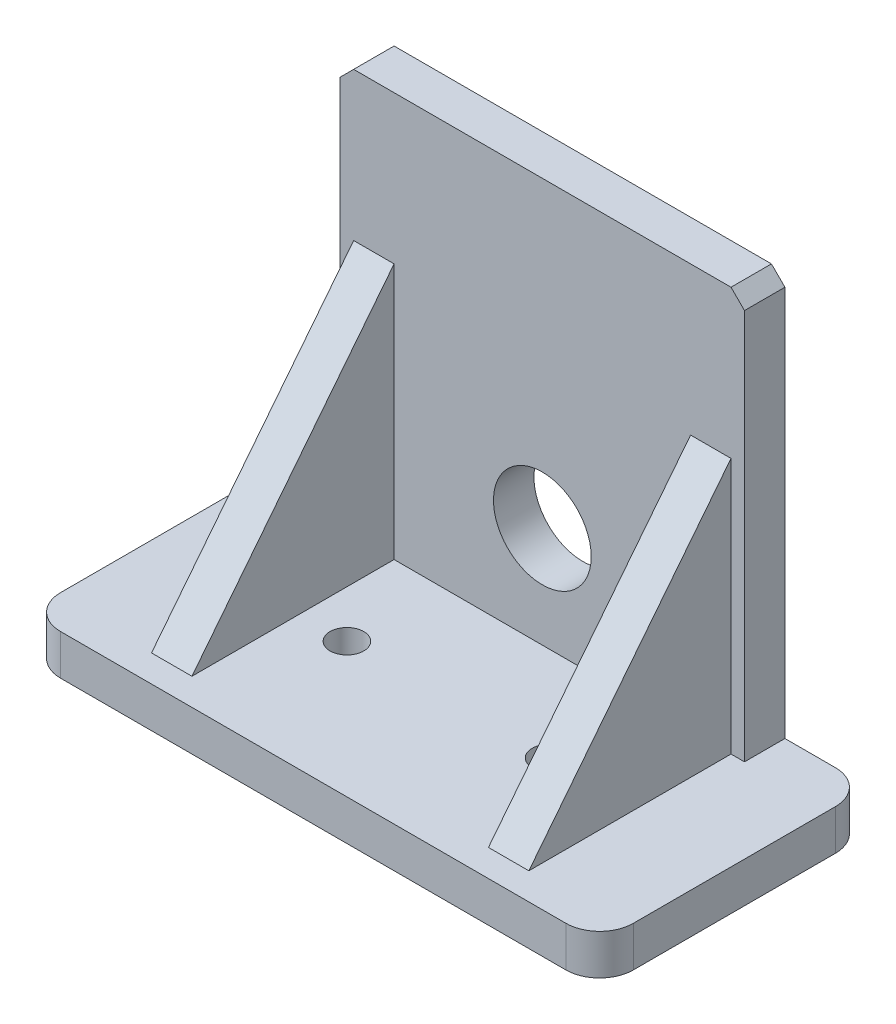
ISO-10303-21;
HEADER;
FILE_DESCRIPTION(('STEP AP214'),'2;1');
FILE_NAME('part.step','',(''),(''),'','','');
FILE_SCHEMA(('AUTOMOTIVE_DESIGN { 1 0 10303 214 1 1 1 1 }'));
ENDSEC;
DATA;
#1=APPLICATION_CONTEXT('core data for automotive mechanical design processes');
#2=APPLICATION_PROTOCOL_DEFINITION('international standard','automotive_design',2000,#1);
#3=PRODUCT_CONTEXT('',#1,'mechanical');
#4=PRODUCT('Part','Part','',(#3));
#5=PRODUCT_RELATED_PRODUCT_CATEGORY('part','',(#4));
#6=PRODUCT_DEFINITION_FORMATION('','',#4);
#7=PRODUCT_DEFINITION_CONTEXT('part definition',#1,'design');
#8=PRODUCT_DEFINITION('design','',#6,#7);
#9=PRODUCT_DEFINITION_SHAPE('','',#8);
#10=(LENGTH_UNIT() NAMED_UNIT(*) SI_UNIT(.MILLI.,.METRE.));
#11=(NAMED_UNIT(*) PLANE_ANGLE_UNIT() SI_UNIT($,.RADIAN.));
#12=(NAMED_UNIT(*) SI_UNIT($,.STERADIAN.) SOLID_ANGLE_UNIT());
#13=UNCERTAINTY_MEASURE_WITH_UNIT(LENGTH_MEASURE(1.E-05),#10,'distance_accuracy_value','');
#14=(GEOMETRIC_REPRESENTATION_CONTEXT(3) GLOBAL_UNCERTAINTY_ASSIGNED_CONTEXT((#13)) GLOBAL_UNIT_ASSIGNED_CONTEXT((#10,
#11,#12)) REPRESENTATION_CONTEXT('',''));
#15=CARTESIAN_POINT('',(0.,0.,0.));
#16=DIRECTION('',(0.,0.,1.));
#17=DIRECTION('',(1.,0.,0.));
#18=AXIS2_PLACEMENT_3D('',#15,#16,#17);
#19=CARTESIAN_POINT('',(-37.5000000000014,6.00000000000078,15.));
#20=DIRECTION('',(0.,-1.,0.));
#21=DIRECTION('',(0.,0.,-0.999999999999958));
#22=AXIS2_PLACEMENT_3D('',#19,#20,#21);
#23=PLANE('',#22);
#24=CARTESIAN_POINT('',(-15.0000000000005,6.00000000000001,0.));
#25=DIRECTION('',(0.,1.,0.));
#26=DIRECTION('',(0.,0.,0.999999999999958));
#27=AXIS2_PLACEMENT_3D('',#24,#25,#26);
#28=CIRCLE('',#27,2.5);
#29=CARTESIAN_POINT('',(-15.0000000000005,6.00000000000001,2.4999999999999));
#30=VERTEX_POINT('',#29);
#31=EDGE_CURVE('E290',#30,#30,#28,.T.);
#32=ORIENTED_EDGE('',*,*,#31,.F.);
#33=EDGE_LOOP('',(#32));
#34=FACE_BOUND('',#33,.T.);
#35=CARTESIAN_POINT('',(15.000000000001,6.00000000000001,0.));
#36=DIRECTION('',(0.,1.,0.));
#37=DIRECTION('',(0.,0.,0.999999999999958));
#38=AXIS2_PLACEMENT_3D('',#35,#36,#37);
#39=CIRCLE('',#38,2.5);
#40=CARTESIAN_POINT('',(15.000000000001,6.00000000000001,2.49999999999989));
#41=VERTEX_POINT('',#40);
#42=EDGE_CURVE('E282',#41,#41,#39,.T.);
#43=ORIENTED_EDGE('',*,*,#42,.F.);
#44=EDGE_LOOP('',(#43));
#45=FACE_BOUND('',#44,.T.);
#46=DIRECTION('',(0.,0.,-0.999999999999958));
#47=VECTOR('',#46,1.);
#48=CARTESIAN_POINT('',(22.0000000000004,5.99999999999923,-14.));
#49=LINE('',#48,#47);
#50=CARTESIAN_POINT('',(22.0000000000006,6.00000000000001,16.));
#51=VERTEX_POINT('',#50);
#52=CARTESIAN_POINT('',(22.0000000000004,5.99999999999923,-14.));
#53=VERTEX_POINT('',#52);
#54=EDGE_CURVE('E193',#51,#53,#49,.T.);
#55=ORIENTED_EDGE('',*,*,#54,.T.);
#56=DIRECTION('',(-1.00000000000004,0.,0.));
#57=VECTOR('',#56,1.);
#58=CARTESIAN_POINT('',(30.0000000000011,5.99999999999923,-14.));
#59=LINE('',#58,#57);
#60=CARTESIAN_POINT('',(-22.000000000001,6.00000000000001,-14.));
#61=VERTEX_POINT('',#60);
#62=EDGE_CURVE('E281',#53,#61,#59,.T.);
#63=ORIENTED_EDGE('',*,*,#62,.T.);
#64=DIRECTION('',(0.,0.,0.999999999999958));
#65=VECTOR('',#64,1.);
#66=CARTESIAN_POINT('',(-22.000000000001,6.00000000000001,-14.));
#67=LINE('',#66,#65);
#68=CARTESIAN_POINT('',(-22.0000000000008,6.00000000000078,16.));
#69=VERTEX_POINT('',#68);
#70=EDGE_CURVE('E225',#61,#69,#67,.T.);
#71=ORIENTED_EDGE('',*,*,#70,.T.);
#72=DIRECTION('',(-1.00000000000004,0.,0.));
#73=VECTOR('',#72,1.);
#74=CARTESIAN_POINT('',(-22.0000000000008,6.00000000000078,16.));
#75=LINE('',#74,#73);
#76=CARTESIAN_POINT('',(-28.0000000000011,6.00000000000078,16.));
#77=VERTEX_POINT('',#76);
#78=EDGE_CURVE('E234',#69,#77,#75,.T.);
#79=ORIENTED_EDGE('',*,*,#78,.T.);
#80=DIRECTION('',(0.,0.,0.999999999999958));
#81=VECTOR('',#80,1.);
#82=CARTESIAN_POINT('',(-28.0000000000013,6.00000000000001,-14.));
#83=LINE('',#82,#81);
#84=CARTESIAN_POINT('',(-28.0000000000013,6.00000000000001,-14.));
#85=VERTEX_POINT('',#84);
#86=EDGE_CURVE('E237',#85,#77,#83,.T.);
#87=ORIENTED_EDGE('',*,*,#86,.F.);
#88=CARTESIAN_POINT('',(-30.0000000000011,6.00000000000001,-14.));
#89=VERTEX_POINT('',#88);
#90=EDGE_CURVE('E261',#85,#89,#59,.T.);
#91=ORIENTED_EDGE('',*,*,#90,.T.);
#92=DIRECTION('',(0.,0.,0.999999999999958));
#93=VECTOR('',#92,1.);
#94=CARTESIAN_POINT('',(-30.0000000000011,6.00000000000078,-19.9999999999992));
#95=LINE('',#94,#93);
#96=CARTESIAN_POINT('',(-30.0000000000011,6.00000000000078,-19.9999999999992));
#97=VERTEX_POINT('',#96);
#98=EDGE_CURVE('E264',#97,#89,#95,.T.);
#99=ORIENTED_EDGE('',*,*,#98,.F.);
#100=DIRECTION('',(-1.00000000000004,0.,0.));
#101=VECTOR('',#100,1.);
#102=CARTESIAN_POINT('',(-37.5000000000014,6.00000000000078,-19.9999999999992));
#103=LINE('',#102,#101);
#104=CARTESIAN_POINT('',(-37.5000000000014,6.00000000000078,-19.9999999999992));
#105=VERTEX_POINT('',#104);
#106=EDGE_CURVE('E315',#97,#105,#103,.T.);
#107=ORIENTED_EDGE('',*,*,#106,.T.);
#108=CARTESIAN_POINT('',(-37.5000000000014,6.00000000000078,-15.));
#109=DIRECTION('',(0.,1.,0.));
#110=DIRECTION('',(0.,0.,-0.999999999999958));
#111=AXIS2_PLACEMENT_3D('',#108,#109,#110);
#112=CIRCLE('',#111,5.);
#113=CARTESIAN_POINT('',(-42.5000000000014,6.00000000000001,-15.));
#114=VERTEX_POINT('',#113);
#115=EDGE_CURVE('E320',#105,#114,#112,.T.);
#116=ORIENTED_EDGE('',*,*,#115,.T.);
#117=DIRECTION('',(0.,0.,0.999999999999958));
#118=VECTOR('',#117,1.);
#119=CARTESIAN_POINT('',(-42.5000000000014,6.00000000000001,15.));
#120=LINE('',#119,#118);
#121=CARTESIAN_POINT('',(-42.5000000000014,6.00000000000001,15.));
#122=VERTEX_POINT('',#121);
#123=EDGE_CURVE('E323',#114,#122,#120,.T.);
#124=ORIENTED_EDGE('',*,*,#123,.T.);
#125=CARTESIAN_POINT('',(-37.5000000000014,6.00000000000078,15.));
#126=DIRECTION('',(0.,1.,0.));
#127=DIRECTION('',(0.,0.,-0.999999999999958));
#128=AXIS2_PLACEMENT_3D('',#125,#126,#127);
#129=CIRCLE('',#128,5.);
#130=CARTESIAN_POINT('',(-37.5000000000014,6.00000000000078,19.9999999999992));
#131=VERTEX_POINT('',#130);
#132=EDGE_CURVE('E298',#122,#131,#129,.T.);
#133=ORIENTED_EDGE('',*,*,#132,.T.);
#134=DIRECTION('',(1.00000000000004,0.,0.));
#135=VECTOR('',#134,1.);
#136=CARTESIAN_POINT('',(-37.5000000000014,6.00000000000078,19.9999999999992));
#137=LINE('',#136,#135);
#138=CARTESIAN_POINT('',(37.5000000000009,6.00000000000001,19.9999999999992));
#139=VERTEX_POINT('',#138);
#140=EDGE_CURVE('E302',#131,#139,#137,.T.);
#141=ORIENTED_EDGE('',*,*,#140,.T.);
#142=CARTESIAN_POINT('',(37.5000000000009,6.00000000000001,15.));
#143=DIRECTION('',(0.,1.,0.));
#144=DIRECTION('',(0.,0.,0.999999999999958));
#145=AXIS2_PLACEMENT_3D('',#142,#143,#144);
#146=CIRCLE('',#145,5.);
#147=CARTESIAN_POINT('',(42.5000000000009,6.00000000000001,15.));
#148=VERTEX_POINT('',#147);
#149=EDGE_CURVE('E306',#139,#148,#146,.T.);
#150=ORIENTED_EDGE('',*,*,#149,.T.);
#151=DIRECTION('',(0.,0.,-0.999999999999958));
#152=VECTOR('',#151,1.);
#153=CARTESIAN_POINT('',(42.5000000000009,6.00000000000001,15.));
#154=LINE('',#153,#152);
#155=CARTESIAN_POINT('',(42.5000000000009,6.00000000000001,-15.));
#156=VERTEX_POINT('',#155);
#157=EDGE_CURVE('E309',#148,#156,#154,.T.);
#158=ORIENTED_EDGE('',*,*,#157,.T.);
#159=CARTESIAN_POINT('',(37.5000000000009,6.00000000000001,-15.));
#160=DIRECTION('',(0.,1.,0.));
#161=DIRECTION('',(0.,0.,-0.999999999999958));
#162=AXIS2_PLACEMENT_3D('',#159,#160,#161);
#163=CIRCLE('',#162,5.);
#164=CARTESIAN_POINT('',(37.5000000000009,6.00000000000078,-19.9999999999992));
#165=VERTEX_POINT('',#164);
#166=EDGE_CURVE('E312',#156,#165,#163,.T.);
#167=ORIENTED_EDGE('',*,*,#166,.T.);
#168=CARTESIAN_POINT('',(30.0000000000011,6.00000000000001,-19.9999999999992));
#169=VERTEX_POINT('',#168);
#170=EDGE_CURVE('E316',#165,#169,#103,.T.);
#171=ORIENTED_EDGE('',*,*,#170,.T.);
#172=DIRECTION('',(0.,0.,0.999999999999958));
#173=VECTOR('',#172,1.);
#174=CARTESIAN_POINT('',(30.0000000000011,6.00000000000001,-19.9999999999992));
#175=LINE('',#174,#173);
#176=CARTESIAN_POINT('',(30.0000000000011,5.99999999999923,-14.));
#177=VERTEX_POINT('',#176);
#178=EDGE_CURVE('E253',#169,#177,#175,.T.);
#179=ORIENTED_EDGE('',*,*,#178,.T.);
#180=CARTESIAN_POINT('',(28.000000000001,5.99999999999923,-14.));
#181=VERTEX_POINT('',#180);
#182=EDGE_CURVE('E278',#177,#181,#59,.T.);
#183=ORIENTED_EDGE('',*,*,#182,.T.);
#184=DIRECTION('',(0.,0.,-0.999999999999958));
#185=VECTOR('',#184,1.);
#186=CARTESIAN_POINT('',(28.000000000001,5.99999999999923,-14.));
#187=LINE('',#186,#185);
#188=CARTESIAN_POINT('',(28.0000000000012,6.00000000000001,16.));
#189=VERTEX_POINT('',#188);
#190=EDGE_CURVE('E202',#189,#181,#187,.T.);
#191=ORIENTED_EDGE('',*,*,#190,.F.);
#192=DIRECTION('',(1.00000000000004,0.,0.));
#193=VECTOR('',#192,1.);
#194=CARTESIAN_POINT('',(22.0000000000006,6.00000000000001,16.));
#195=LINE('',#194,#193);
#196=EDGE_CURVE('E192',#51,#189,#195,.T.);
#197=ORIENTED_EDGE('',*,*,#196,.F.);
#198=EDGE_LOOP('',(#55,#63,#71,#79,#87,#91,#99,#107,#116,#124,#133,#141,#150,#158,#167,#171,
#179,#183,#191,#197));
#199=FACE_BOUND('',#198,.T.);
#200=ADVANCED_FACE('F38',(#34,#45,#199),#23,.F.);
#201=CARTESIAN_POINT('',(30.0000000000011,5.99999999999923,-14.));
#202=DIRECTION('',(0.,0.,0.999999999999958));
#203=DIRECTION('',(1.00000000000004,0.,0.));
#204=AXIS2_PLACEMENT_3D('',#201,#202,#203);
#205=PLANE('',#204);
#206=CARTESIAN_POINT('',(0.,21.,-14.));
#207=DIRECTION('',(0.,0.,0.999999999999958));
#208=DIRECTION('',(1.00000000000004,0.,0.));
#209=AXIS2_PLACEMENT_3D('',#206,#207,#208);
#210=CIRCLE('',#209,7.25);
#211=CARTESIAN_POINT('',(7.25000000000034,21.,-14.));
#212=VERTEX_POINT('',#211);
#213=EDGE_CURVE('E211',#212,#212,#210,.T.);
#214=ORIENTED_EDGE('',*,*,#213,.F.);
#215=EDGE_LOOP('',(#214));
#216=FACE_BOUND('',#215,.T.);
#217=DIRECTION('',(0.,1.,0.));
#218=VECTOR('',#217,1.);
#219=CARTESIAN_POINT('',(30.0000000000011,5.99999999999923,-14.));
#220=LINE('',#219,#218);
#221=CARTESIAN_POINT('',(30.0000000000015,63.9999999999986,-13.9999999999992));
#222=VERTEX_POINT('',#221);
#223=EDGE_CURVE('E258',#177,#222,#220,.T.);
#224=ORIENTED_EDGE('',*,*,#223,.T.);
#225=DIRECTION('',(0.707106781186568,-0.707106781186555,0.));
#226=VECTOR('',#225,1.);
#227=CARTESIAN_POINT('',(59.0000000000028,34.9999999999985,-13.9999999999992));
#228=LINE('',#227,#226);
#229=CARTESIAN_POINT('',(28.0000000000015,66.,-14.));
#230=VERTEX_POINT('',#229);
#231=EDGE_CURVE('E48',#222,#230,#228,.F.);
#232=ORIENTED_EDGE('',*,*,#231,.T.);
#233=DIRECTION('',(-1.00000000000004,0.,0.));
#234=VECTOR('',#233,1.);
#235=CARTESIAN_POINT('',(30.0000000000018,65.9999999999987,-14.));
#236=LINE('',#235,#234);
#237=CARTESIAN_POINT('',(-28.0000000000008,66.,-14.));
#238=VERTEX_POINT('',#237);
#239=EDGE_CURVE('E275',#230,#238,#236,.T.);
#240=ORIENTED_EDGE('',*,*,#239,.T.);
#241=DIRECTION('',(-0.707106781186564,-0.70710678118654,0.));
#242=VECTOR('',#241,1.);
#243=CARTESIAN_POINT('',(-29.0000000000004,65.000000000001,-14.));
#244=LINE('',#243,#242);
#245=CARTESIAN_POINT('',(-30.0000000000006,64.0000000000008,-13.9999999999992));
#246=VERTEX_POINT('',#245);
#247=EDGE_CURVE('E55',#238,#246,#244,.T.);
#248=ORIENTED_EDGE('',*,*,#247,.T.);
#249=DIRECTION('',(0.,1.,0.));
#250=VECTOR('',#249,1.);
#251=CARTESIAN_POINT('',(-30.0000000000011,6.00000000000001,-14.));
#252=LINE('',#251,#250);
#253=EDGE_CURVE('E254',#89,#246,#252,.T.);
#254=ORIENTED_EDGE('',*,*,#253,.F.);
#255=ORIENTED_EDGE('',*,*,#90,.F.);
#256=DIRECTION('',(0.,-1.,0.));
#257=VECTOR('',#256,1.);
#258=CARTESIAN_POINT('',(-28.0000000000013,6.00000000000001,-14.));
#259=LINE('',#258,#257);
#260=CARTESIAN_POINT('',(-28.0000000000012,44.,-14.));
#261=VERTEX_POINT('',#260);
#262=EDGE_CURVE('E219',#261,#85,#259,.T.);
#263=ORIENTED_EDGE('',*,*,#262,.F.);
#264=DIRECTION('',(-1.00000000000004,0.,0.));
#265=VECTOR('',#264,1.);
#266=CARTESIAN_POINT('',(-22.0000000000009,44.,-14.));
#267=LINE('',#266,#265);
#268=CARTESIAN_POINT('',(-22.0000000000009,44.,-14.));
#269=VERTEX_POINT('',#268);
#270=EDGE_CURVE('E242',#269,#261,#267,.T.);
#271=ORIENTED_EDGE('',*,*,#270,.F.);
#272=DIRECTION('',(0.,-1.,0.));
#273=VECTOR('',#272,1.);
#274=CARTESIAN_POINT('',(-22.000000000001,6.00000000000001,-14.));
#275=LINE('',#274,#273);
#276=EDGE_CURVE('E221',#269,#61,#275,.T.);
#277=ORIENTED_EDGE('',*,*,#276,.T.);
#278=ORIENTED_EDGE('',*,*,#62,.F.);
#279=DIRECTION('',(0.,1.,0.));
#280=VECTOR('',#279,1.);
#281=CARTESIAN_POINT('',(22.0000000000004,5.99999999999923,-14.));
#282=LINE('',#281,#280);
#283=CARTESIAN_POINT('',(22.0000000000006,43.9999999999992,-14.));
#284=VERTEX_POINT('',#283);
#285=EDGE_CURVE('E187',#53,#284,#282,.T.);
#286=ORIENTED_EDGE('',*,*,#285,.T.);
#287=DIRECTION('',(1.00000000000004,0.,0.));
#288=VECTOR('',#287,1.);
#289=CARTESIAN_POINT('',(22.0000000000006,43.9999999999992,-14.));
#290=LINE('',#289,#288);
#291=CARTESIAN_POINT('',(28.0000000000011,44.,-14.));
#292=VERTEX_POINT('',#291);
#293=EDGE_CURVE('E179',#284,#292,#290,.T.);
#294=ORIENTED_EDGE('',*,*,#293,.T.);
#295=DIRECTION('',(0.,1.,0.));
#296=VECTOR('',#295,1.);
#297=CARTESIAN_POINT('',(28.000000000001,5.99999999999923,-14.));
#298=LINE('',#297,#296);
#299=EDGE_CURVE('E183',#181,#292,#298,.T.);
#300=ORIENTED_EDGE('',*,*,#299,.F.);
#301=ORIENTED_EDGE('',*,*,#182,.F.);
#302=EDGE_LOOP('',(#224,#232,#240,#248,#254,#255,#263,#271,#277,#278,#286,#294,#300,#301));
#303=FACE_BOUND('',#302,.T.);
#304=ADVANCED_FACE('F181',(#216,#303),#205,.T.);
#305=CARTESIAN_POINT('',(-37.5000000000012,0.,15.));
#306=DIRECTION('',(0.,-1.,0.));
#307=DIRECTION('',(0.,0.,-0.999999999999958));
#308=AXIS2_PLACEMENT_3D('',#305,#306,#307);
#309=PLANE('',#308);
#310=CARTESIAN_POINT('',(-15.0000000000004,0.,0.));
#311=DIRECTION('',(0.,1.,0.));
#312=DIRECTION('',(0.,0.,0.999999999999958));
#313=AXIS2_PLACEMENT_3D('',#310,#311,#312);
#314=CIRCLE('',#313,2.5);
#315=CARTESIAN_POINT('',(-15.0000000000004,0.,2.4999999999999));
#316=VERTEX_POINT('',#315);
#317=EDGE_CURVE('E286',#316,#316,#314,.T.);
#318=ORIENTED_EDGE('',*,*,#317,.T.);
#319=EDGE_LOOP('',(#318));
#320=FACE_BOUND('',#319,.T.);
#321=CARTESIAN_POINT('',(-37.5000000000012,0.,15.));
#322=DIRECTION('',(0.,1.,0.));
#323=DIRECTION('',(0.,0.,-0.999999999999958));
#324=AXIS2_PLACEMENT_3D('',#321,#322,#323);
#325=CIRCLE('',#324,5.);
#326=CARTESIAN_POINT('',(-42.5000000000012,0.,15.));
#327=VERTEX_POINT('',#326);
#328=CARTESIAN_POINT('',(-37.5000000000011,1.55431223447522E-12,19.9999999999992));
#329=VERTEX_POINT('',#328);
#330=EDGE_CURVE('E294',#327,#329,#325,.T.);
#331=ORIENTED_EDGE('',*,*,#330,.F.);
#332=DIRECTION('',(0.,0.,0.999999999999958));
#333=VECTOR('',#332,1.);
#334=CARTESIAN_POINT('',(-42.5000000000012,0.,15.));
#335=LINE('',#334,#333);
#336=CARTESIAN_POINT('',(-42.5000000000012,0.,-15.));
#337=VERTEX_POINT('',#336);
#338=EDGE_CURVE('E303',#337,#327,#335,.T.);
#339=ORIENTED_EDGE('',*,*,#338,.F.);
#340=CARTESIAN_POINT('',(-37.5000000000012,0.,-15.));
#341=DIRECTION('',(0.,1.,0.));
#342=DIRECTION('',(0.,0.,-0.999999999999958));
#343=AXIS2_PLACEMENT_3D('',#340,#341,#342);
#344=CIRCLE('',#343,5.);
#345=CARTESIAN_POINT('',(-37.5000000000011,0.,-20.));
#346=VERTEX_POINT('',#345);
#347=EDGE_CURVE('E345',#346,#337,#344,.T.);
#348=ORIENTED_EDGE('',*,*,#347,.F.);
#349=DIRECTION('',(-1.00000000000004,0.,0.));
#350=VECTOR('',#349,1.);
#351=CARTESIAN_POINT('',(-37.5000000000011,0.,-20.));
#352=LINE('',#351,#350);
#353=CARTESIAN_POINT('',(37.5000000000011,-1.55431223447522E-12,-20.));
#354=VERTEX_POINT('',#353);
#355=EDGE_CURVE('E342',#354,#346,#352,.T.);
#356=ORIENTED_EDGE('',*,*,#355,.F.);
#357=CARTESIAN_POINT('',(37.5000000000012,-2.60902410786912E-12,-15.));
#358=DIRECTION('',(0.,1.,0.));
#359=DIRECTION('',(0.,0.,-0.999999999999958));
#360=AXIS2_PLACEMENT_3D('',#357,#358,#359);
#361=CIRCLE('',#360,5.);
#362=CARTESIAN_POINT('',(42.5000000000012,0.,-15.));
#363=VERTEX_POINT('',#362);
#364=EDGE_CURVE('E339',#363,#354,#361,.T.);
#365=ORIENTED_EDGE('',*,*,#364,.F.);
#366=DIRECTION('',(0.,0.,-0.999999999999958));
#367=VECTOR('',#366,1.);
#368=CARTESIAN_POINT('',(42.5000000000012,-2.60902410786912E-12,15.));
#369=LINE('',#368,#367);
#370=CARTESIAN_POINT('',(42.5000000000012,-2.60902410786912E-12,15.));
#371=VERTEX_POINT('',#370);
#372=EDGE_CURVE('E336',#371,#363,#369,.T.);
#373=ORIENTED_EDGE('',*,*,#372,.F.);
#374=CARTESIAN_POINT('',(37.5000000000012,0.,15.));
#375=DIRECTION('',(0.,1.,0.));
#376=DIRECTION('',(0.,0.,0.999999999999958));
#377=AXIS2_PLACEMENT_3D('',#374,#375,#376);
#378=CIRCLE('',#377,5.);
#379=CARTESIAN_POINT('',(37.5000000000011,-2.60902410786912E-12,19.9999999999992));
#380=VERTEX_POINT('',#379);
#381=EDGE_CURVE('E333',#380,#371,#378,.T.);
#382=ORIENTED_EDGE('',*,*,#381,.F.);
#383=DIRECTION('',(1.00000000000004,0.,0.));
#384=VECTOR('',#383,1.);
#385=CARTESIAN_POINT('',(-37.5000000000011,1.55431223447522E-12,19.9999999999992));
#386=LINE('',#385,#384);
#387=EDGE_CURVE('E330',#329,#380,#386,.T.);
#388=ORIENTED_EDGE('',*,*,#387,.F.);
#389=EDGE_LOOP('',(#331,#339,#348,#356,#365,#373,#382,#388));
#390=FACE_BOUND('',#389,.T.);
#391=CARTESIAN_POINT('',(15.0000000000008,0.,0.));
#392=DIRECTION('',(0.,1.,0.));
#393=DIRECTION('',(0.,0.,0.999999999999958));
#394=AXIS2_PLACEMENT_3D('',#391,#392,#393);
#395=CIRCLE('',#394,2.5);
#396=CARTESIAN_POINT('',(15.0000000000007,0.,2.49999999999989));
#397=VERTEX_POINT('',#396);
#398=EDGE_CURVE('E274',#397,#397,#395,.T.);
#399=ORIENTED_EDGE('',*,*,#398,.T.);
#400=EDGE_LOOP('',(#399));
#401=FACE_BOUND('',#400,.T.);
#402=ADVANCED_FACE('F423',(#320,#390,#401),#309,.T.);
#403=CARTESIAN_POINT('',(-37.5000000000014,6.00000000000078,15.));
#404=DIRECTION('',(0.,-1.,0.));
#405=DIRECTION('',(0.,0.,-0.999999999999958));
#406=AXIS2_PLACEMENT_3D('',#403,#404,#405);
#407=CYLINDRICAL_SURFACE('',#406,5.);
#408=ORIENTED_EDGE('',*,*,#330,.T.);
#409=DIRECTION('',(0.,-1.,0.));
#410=VECTOR('',#409,1.);
#411=CARTESIAN_POINT('',(-37.5000000000014,6.00000000000078,19.9999999999992));
#412=LINE('',#411,#410);
#413=EDGE_CURVE('E377',#131,#329,#412,.T.);
#414=ORIENTED_EDGE('',*,*,#413,.F.);
#415=ORIENTED_EDGE('',*,*,#132,.F.);
#416=DIRECTION('',(0.,-1.,0.));
#417=VECTOR('',#416,1.);
#418=CARTESIAN_POINT('',(-42.5000000000014,6.00000000000001,15.));
#419=LINE('',#418,#417);
#420=EDGE_CURVE('E326',#122,#327,#419,.T.);
#421=ORIENTED_EDGE('',*,*,#420,.T.);
#422=EDGE_LOOP('',(#408,#414,#415,#421));
#423=FACE_BOUND('',#422,.T.);
#424=ADVANCED_FACE('F507',(#423),#407,.T.);
#425=CARTESIAN_POINT('',(-37.5000000000014,6.00000000000078,19.9999999999992));
#426=DIRECTION('',(0.,0.,-0.999999999999958));
#427=DIRECTION('',(-1.00000000000004,0.,0.));
#428=AXIS2_PLACEMENT_3D('',#425,#426,#427);
#429=PLANE('',#428);
#430=ORIENTED_EDGE('',*,*,#387,.T.);
#431=DIRECTION('',(0.,-1.,0.));
#432=VECTOR('',#431,1.);
#433=CARTESIAN_POINT('',(37.5000000000009,6.00000000000001,19.9999999999992));
#434=LINE('',#433,#432);
#435=EDGE_CURVE('E373',#139,#380,#434,.T.);
#436=ORIENTED_EDGE('',*,*,#435,.F.);
#437=ORIENTED_EDGE('',*,*,#140,.F.);
#438=ORIENTED_EDGE('',*,*,#413,.T.);
#439=EDGE_LOOP('',(#430,#436,#437,#438));
#440=FACE_BOUND('',#439,.T.);
#441=ADVANCED_FACE('F540',(#440),#429,.F.);
#442=CARTESIAN_POINT('',(37.5000000000009,6.00000000000001,15.));
#443=DIRECTION('',(0.,-1.,0.));
#444=DIRECTION('',(0.,0.,-0.999999999999958));
#445=AXIS2_PLACEMENT_3D('',#442,#443,#444);
#446=CYLINDRICAL_SURFACE('',#445,5.);
#447=ORIENTED_EDGE('',*,*,#381,.T.);
#448=DIRECTION('',(0.,-1.,0.));
#449=VECTOR('',#448,1.);
#450=CARTESIAN_POINT('',(42.5000000000009,6.00000000000001,15.));
#451=LINE('',#450,#449);
#452=EDGE_CURVE('E369',#148,#371,#451,.T.);
#453=ORIENTED_EDGE('',*,*,#452,.F.);
#454=ORIENTED_EDGE('',*,*,#149,.F.);
#455=ORIENTED_EDGE('',*,*,#435,.T.);
#456=EDGE_LOOP('',(#447,#453,#454,#455));
#457=FACE_BOUND('',#456,.T.);
#458=ADVANCED_FACE('F536',(#457),#446,.T.);
#459=CARTESIAN_POINT('',(42.5000000000009,6.00000000000001,15.));
#460=DIRECTION('',(-1.00000000000004,0.,0.));
#461=DIRECTION('',(0.,0.,0.999999999999958));
#462=AXIS2_PLACEMENT_3D('',#459,#460,#461);
#463=PLANE('',#462);
#464=ORIENTED_EDGE('',*,*,#372,.T.);
#465=DIRECTION('',(0.,-1.,0.));
#466=VECTOR('',#465,1.);
#467=CARTESIAN_POINT('',(42.5000000000009,6.00000000000001,-15.));
#468=LINE('',#467,#466);
#469=EDGE_CURVE('E365',#156,#363,#468,.T.);
#470=ORIENTED_EDGE('',*,*,#469,.F.);
#471=ORIENTED_EDGE('',*,*,#157,.F.);
#472=ORIENTED_EDGE('',*,*,#452,.T.);
#473=EDGE_LOOP('',(#464,#470,#471,#472));
#474=FACE_BOUND('',#473,.T.);
#475=ADVANCED_FACE('F533',(#474),#463,.F.);
#476=CARTESIAN_POINT('',(37.5000000000009,6.00000000000001,-15.));
#477=DIRECTION('',(0.,-1.,0.));
#478=DIRECTION('',(0.,0.,-0.999999999999958));
#479=AXIS2_PLACEMENT_3D('',#476,#477,#478);
#480=CYLINDRICAL_SURFACE('',#479,5.);
#481=ORIENTED_EDGE('',*,*,#364,.T.);
#482=DIRECTION('',(0.,-1.,0.));
#483=VECTOR('',#482,1.);
#484=CARTESIAN_POINT('',(37.5000000000009,6.00000000000078,-19.9999999999992));
#485=LINE('',#484,#483);
#486=EDGE_CURVE('E361',#165,#354,#485,.T.);
#487=ORIENTED_EDGE('',*,*,#486,.F.);
#488=ORIENTED_EDGE('',*,*,#166,.F.);
#489=ORIENTED_EDGE('',*,*,#469,.T.);
#490=EDGE_LOOP('',(#481,#487,#488,#489));
#491=FACE_BOUND('',#490,.T.);
#492=ADVANCED_FACE('F529',(#491),#480,.T.);
#493=CARTESIAN_POINT('',(-37.5000000000014,6.00000000000078,-19.9999999999992));
#494=DIRECTION('',(0.,0.,0.999999999999958));
#495=DIRECTION('',(1.00000000000004,0.,0.));
#496=AXIS2_PLACEMENT_3D('',#493,#494,#495);
#497=PLANE('',#496);
#498=CARTESIAN_POINT('',(1.17527515497429E-13,21.,-19.9999999999992));
#499=DIRECTION('',(0.,0.,0.999999999999958));
#500=DIRECTION('',(1.00000000000004,0.,0.));
#501=AXIS2_PLACEMENT_3D('',#498,#499,#500);
#502=CIRCLE('',#501,7.25);
#503=CARTESIAN_POINT('',(7.25000000000038,21.,-19.9999999999992));
#504=VERTEX_POINT('',#503);
#505=EDGE_CURVE('E206',#504,#504,#502,.T.);
#506=ORIENTED_EDGE('',*,*,#505,.T.);
#507=EDGE_LOOP('',(#506));
#508=FACE_BOUND('',#507,.T.);
#509=DIRECTION('',(-1.00000000000004,0.,0.));
#510=VECTOR('',#509,1.);
#511=CARTESIAN_POINT('',(30.0000000000018,65.9999999999992,-19.9999999999992));
#512=LINE('',#511,#510);
#513=CARTESIAN_POINT('',(28.0000000000015,65.9999999999999,-19.9999999999992));
#514=VERTEX_POINT('',#513);
#515=CARTESIAN_POINT('',(-28.0000000000008,66.,-19.9999999999992));
#516=VERTEX_POINT('',#515);
#517=EDGE_CURVE('E270',#514,#516,#512,.T.);
#518=ORIENTED_EDGE('',*,*,#517,.F.);
#519=DIRECTION('',(-0.707106781186568,0.707106781186555,0.));
#520=VECTOR('',#519,1.);
#521=CARTESIAN_POINT('',(28.0000000000015,65.9999999999999,-19.9999999999992));
#522=LINE('',#521,#520);
#523=CARTESIAN_POINT('',(30.0000000000015,63.9999999999992,-19.9999999999992));
#524=VERTEX_POINT('',#523);
#525=EDGE_CURVE('E391',#514,#524,#522,.F.);
#526=ORIENTED_EDGE('',*,*,#525,.T.);
#527=DIRECTION('',(0.,-1.,0.));
#528=VECTOR('',#527,1.);
#529=CARTESIAN_POINT('',(30.0000000000011,6.00000000000001,-19.9999999999992));
#530=LINE('',#529,#528);
#531=EDGE_CURVE('E250',#524,#169,#530,.T.);
#532=ORIENTED_EDGE('',*,*,#531,.T.);
#533=ORIENTED_EDGE('',*,*,#170,.F.);
#534=ORIENTED_EDGE('',*,*,#486,.T.);
#535=ORIENTED_EDGE('',*,*,#355,.T.);
#536=DIRECTION('',(0.,-1.,0.));
#537=VECTOR('',#536,1.);
#538=CARTESIAN_POINT('',(-37.5000000000014,6.00000000000078,-19.9999999999992));
#539=LINE('',#538,#537);
#540=EDGE_CURVE('E357',#105,#346,#539,.T.);
#541=ORIENTED_EDGE('',*,*,#540,.F.);
#542=ORIENTED_EDGE('',*,*,#106,.F.);
#543=DIRECTION('',(0.,-1.,0.));
#544=VECTOR('',#543,1.);
#545=CARTESIAN_POINT('',(-30.0000000000011,6.00000000000078,-19.9999999999992));
#546=LINE('',#545,#544);
#547=CARTESIAN_POINT('',(-30.0000000000006,64.0000000000008,-19.9999999999992));
#548=VERTEX_POINT('',#547);
#549=EDGE_CURVE('E246',#548,#97,#546,.T.);
#550=ORIENTED_EDGE('',*,*,#549,.F.);
#551=DIRECTION('',(0.707106781186564,0.70710678118654,0.));
#552=VECTOR('',#551,1.);
#553=CARTESIAN_POINT('',(-30.0000000000006,64.0000000000008,-19.9999999999992));
#554=LINE('',#553,#552);
#555=EDGE_CURVE('E388',#548,#516,#554,.T.);
#556=ORIENTED_EDGE('',*,*,#555,.T.);
#557=EDGE_LOOP('',(#518,#526,#532,#533,#534,#535,#541,#542,#550,#556));
#558=FACE_BOUND('',#557,.T.);
#559=ADVANCED_FACE('F409',(#508,#558),#497,.F.);
#560=CARTESIAN_POINT('',(-37.5000000000014,6.00000000000078,-15.));
#561=DIRECTION('',(0.,-1.,0.));
#562=DIRECTION('',(0.,0.,-0.999999999999958));
#563=AXIS2_PLACEMENT_3D('',#560,#561,#562);
#564=CYLINDRICAL_SURFACE('',#563,5.);
#565=ORIENTED_EDGE('',*,*,#347,.T.);
#566=DIRECTION('',(0.,-1.,0.));
#567=VECTOR('',#566,1.);
#568=CARTESIAN_POINT('',(-42.5000000000014,6.00000000000001,-15.));
#569=LINE('',#568,#567);
#570=EDGE_CURVE('E353',#114,#337,#569,.T.);
#571=ORIENTED_EDGE('',*,*,#570,.F.);
#572=ORIENTED_EDGE('',*,*,#115,.F.);
#573=ORIENTED_EDGE('',*,*,#540,.T.);
#574=EDGE_LOOP('',(#565,#571,#572,#573));
#575=FACE_BOUND('',#574,.T.);
#576=ADVANCED_FACE('F429',(#575),#564,.T.);
#577=CARTESIAN_POINT('',(-42.5000000000014,6.00000000000001,15.));
#578=DIRECTION('',(1.00000000000004,0.,0.));
#579=DIRECTION('',(0.,0.,-0.999999999999958));
#580=AXIS2_PLACEMENT_3D('',#577,#578,#579);
#581=PLANE('',#580);
#582=ORIENTED_EDGE('',*,*,#338,.T.);
#583=ORIENTED_EDGE('',*,*,#420,.F.);
#584=ORIENTED_EDGE('',*,*,#123,.F.);
#585=ORIENTED_EDGE('',*,*,#570,.T.);
#586=EDGE_LOOP('',(#582,#583,#584,#585));
#587=FACE_BOUND('',#586,.T.);
#588=ADVANCED_FACE('F433',(#587),#581,.F.);
#589=CARTESIAN_POINT('',(-15.0000000000005,6.00000000000001,0.));
#590=DIRECTION('',(0.,-1.,0.));
#591=DIRECTION('',(0.,0.,-0.999999999999958));
#592=AXIS2_PLACEMENT_3D('',#589,#590,#591);
#593=CYLINDRICAL_SURFACE('',#592,2.5);
#594=ORIENTED_EDGE('',*,*,#31,.T.);
#595=EDGE_LOOP('',(#594));
#596=FACE_BOUND('',#595,.T.);
#597=ORIENTED_EDGE('',*,*,#317,.F.);
#598=EDGE_LOOP('',(#597));
#599=FACE_BOUND('',#598,.T.);
#600=ADVANCED_FACE('F518',(#596,#599),#593,.F.);
#601=CARTESIAN_POINT('',(15.000000000001,6.00000000000001,0.));
#602=DIRECTION('',(0.,-1.,0.));
#603=DIRECTION('',(0.,0.,-0.999999999999958));
#604=AXIS2_PLACEMENT_3D('',#601,#602,#603);
#605=CYLINDRICAL_SURFACE('',#604,2.5);
#606=ORIENTED_EDGE('',*,*,#42,.T.);
#607=EDGE_LOOP('',(#606));
#608=FACE_BOUND('',#607,.T.);
#609=ORIENTED_EDGE('',*,*,#398,.F.);
#610=EDGE_LOOP('',(#609));
#611=FACE_BOUND('',#610,.T.);
#612=ADVANCED_FACE('F515',(#608,#611),#605,.F.);
#613=CARTESIAN_POINT('',(30.0000000000018,65.9999999999992,-19.9999999999992));
#614=DIRECTION('',(0.,1.,0.));
#615=DIRECTION('',(0.,0.,0.999999999999958));
#616=AXIS2_PLACEMENT_3D('',#613,#614,#615);
#617=PLANE('',#616);
#618=ORIENTED_EDGE('',*,*,#239,.F.);
#619=DIRECTION('',(0.,0.,-0.999999999999958));
#620=VECTOR('',#619,1.);
#621=CARTESIAN_POINT('',(28.0000000000015,65.9999999999999,-19.9999999999992));
#622=LINE('',#621,#620);
#623=EDGE_CURVE('E384',#230,#514,#622,.T.);
#624=ORIENTED_EDGE('',*,*,#623,.T.);
#625=ORIENTED_EDGE('',*,*,#517,.T.);
#626=DIRECTION('',(0.,0.,0.999999999999958));
#627=VECTOR('',#626,1.);
#628=CARTESIAN_POINT('',(-28.0000000000008,66.,-14.));
#629=LINE('',#628,#627);
#630=EDGE_CURVE('E381',#516,#238,#629,.T.);
#631=ORIENTED_EDGE('',*,*,#630,.T.);
#632=EDGE_LOOP('',(#618,#624,#625,#631));
#633=FACE_BOUND('',#632,.T.);
#634=ADVANCED_FACE('F404',(#633),#617,.T.);
#635=CARTESIAN_POINT('',(30.0000000000017,-2.60902410786912E-12,0.));
#636=DIRECTION('',(1.00000000000004,0.,0.));
#637=DIRECTION('',(0.,0.,-0.999999999999958));
#638=AXIS2_PLACEMENT_3D('',#635,#636,#637);
#639=PLANE('',#638);
#640=ORIENTED_EDGE('',*,*,#531,.F.);
#641=DIRECTION('',(0.,0.,0.999999999999958));
#642=VECTOR('',#641,1.);
#643=CARTESIAN_POINT('',(30.0000000000015,63.9999999999987,0.));
#644=LINE('',#643,#642);
#645=EDGE_CURVE('E63',#524,#222,#644,.T.);
#646=ORIENTED_EDGE('',*,*,#645,.T.);
#647=ORIENTED_EDGE('',*,*,#223,.F.);
#648=ORIENTED_EDGE('',*,*,#178,.F.);
#649=EDGE_LOOP('',(#640,#646,#647,#648));
#650=FACE_BOUND('',#649,.T.);
#651=ADVANCED_FACE('F412',(#650),#639,.T.);
#652=CARTESIAN_POINT('',(-30.0000000000012,0.,0.));
#653=DIRECTION('',(1.00000000000004,0.,0.));
#654=DIRECTION('',(0.,0.,-0.999999999999958));
#655=AXIS2_PLACEMENT_3D('',#652,#653,#654);
#656=PLANE('',#655);
#657=ORIENTED_EDGE('',*,*,#253,.T.);
#658=DIRECTION('',(0.,0.,-0.999999999999958));
#659=VECTOR('',#658,1.);
#660=CARTESIAN_POINT('',(-30.0000000000006,64.0000000000008,-19.9999999999992));
#661=LINE('',#660,#659);
#662=EDGE_CURVE('E11',#246,#548,#661,.T.);
#663=ORIENTED_EDGE('',*,*,#662,.T.);
#664=ORIENTED_EDGE('',*,*,#549,.T.);
#665=ORIENTED_EDGE('',*,*,#98,.T.);
#666=EDGE_LOOP('',(#657,#663,#664,#665));
#667=FACE_BOUND('',#666,.T.);
#668=ADVANCED_FACE('F581',(#667),#656,.F.);
#669=CARTESIAN_POINT('',(-22.0000000000008,6.00000000000078,16.));
#670=DIRECTION('',(0.,0.619644288579021,0.784882765533384));
#671=DIRECTION('',(0.,-0.784882765533426,0.619644288578979));
#672=AXIS2_PLACEMENT_3D('',#669,#670,#671);
#673=PLANE('',#672);
#674=DIRECTION('',(0.,0.784882765533426,-0.619644288578979));
#675=VECTOR('',#674,1.);
#676=CARTESIAN_POINT('',(-28.0000000000011,6.00000000000078,16.));
#677=LINE('',#676,#675);
#678=EDGE_CURVE('E226',#77,#261,#677,.T.);
#679=ORIENTED_EDGE('',*,*,#678,.F.);
#680=ORIENTED_EDGE('',*,*,#78,.F.);
#681=DIRECTION('',(0.,0.784882765533426,-0.619644288578979));
#682=VECTOR('',#681,1.);
#683=CARTESIAN_POINT('',(-22.0000000000008,6.00000000000078,16.));
#684=LINE('',#683,#682);
#685=EDGE_CURVE('E230',#69,#269,#684,.T.);
#686=ORIENTED_EDGE('',*,*,#685,.T.);
#687=ORIENTED_EDGE('',*,*,#270,.T.);
#688=EDGE_LOOP('',(#679,#680,#686,#687));
#689=FACE_BOUND('',#688,.T.);
#690=ADVANCED_FACE('F574',(#689),#673,.T.);
#691=CARTESIAN_POINT('',(-22.0000000000007,0.,0.));
#692=DIRECTION('',(1.00000000000004,0.,0.));
#693=DIRECTION('',(0.,0.,-0.999999999999958));
#694=AXIS2_PLACEMENT_3D('',#691,#692,#693);
#695=PLANE('',#694);
#696=ORIENTED_EDGE('',*,*,#276,.F.);
#697=ORIENTED_EDGE('',*,*,#685,.F.);
#698=ORIENTED_EDGE('',*,*,#70,.F.);
#699=EDGE_LOOP('',(#696,#697,#698));
#700=FACE_BOUND('',#699,.T.);
#701=ADVANCED_FACE('F571',(#700),#695,.T.);
#702=CARTESIAN_POINT('',(-28.000000000001,0.,0.));
#703=DIRECTION('',(1.00000000000004,0.,0.));
#704=DIRECTION('',(0.,0.,-0.999999999999958));
#705=AXIS2_PLACEMENT_3D('',#702,#703,#704);
#706=PLANE('',#705);
#707=ORIENTED_EDGE('',*,*,#262,.T.);
#708=ORIENTED_EDGE('',*,*,#86,.T.);
#709=ORIENTED_EDGE('',*,*,#678,.T.);
#710=EDGE_LOOP('',(#707,#708,#709));
#711=FACE_BOUND('',#710,.T.);
#712=ADVANCED_FACE('F570',(#711),#706,.F.);
#713=CARTESIAN_POINT('',(22.0000000000006,6.00000000000001,16.));
#714=DIRECTION('',(0.,0.619644288579021,0.784882765533384));
#715=DIRECTION('',(0.,-0.784882765533426,0.619644288578979));
#716=AXIS2_PLACEMENT_3D('',#713,#714,#715);
#717=PLANE('',#716);
#718=DIRECTION('',(0.,-0.784882765533426,0.619644288578979));
#719=VECTOR('',#718,1.);
#720=CARTESIAN_POINT('',(28.0000000000012,6.00000000000001,16.));
#721=LINE('',#720,#719);
#722=EDGE_CURVE('E197',#292,#189,#721,.T.);
#723=ORIENTED_EDGE('',*,*,#722,.F.);
#724=ORIENTED_EDGE('',*,*,#293,.F.);
#725=DIRECTION('',(0.,-0.784882765533426,0.619644288578979));
#726=VECTOR('',#725,1.);
#727=CARTESIAN_POINT('',(22.0000000000006,6.00000000000001,16.));
#728=LINE('',#727,#726);
#729=EDGE_CURVE('E486',#284,#51,#728,.T.);
#730=ORIENTED_EDGE('',*,*,#729,.T.);
#731=ORIENTED_EDGE('',*,*,#196,.T.);
#732=EDGE_LOOP('',(#723,#724,#730,#731));
#733=FACE_BOUND('',#732,.T.);
#734=ADVANCED_FACE('F198',(#733),#717,.T.);
#735=CARTESIAN_POINT('',(22.0000000000007,-2.60902410786912E-12,0.));
#736=DIRECTION('',(1.00000000000004,0.,0.));
#737=DIRECTION('',(0.,0.,-0.999999999999958));
#738=AXIS2_PLACEMENT_3D('',#735,#736,#737);
#739=PLANE('',#738);
#740=ORIENTED_EDGE('',*,*,#285,.F.);
#741=ORIENTED_EDGE('',*,*,#54,.F.);
#742=ORIENTED_EDGE('',*,*,#729,.F.);
#743=EDGE_LOOP('',(#740,#741,#742));
#744=FACE_BOUND('',#743,.T.);
#745=ADVANCED_FACE('F561',(#744),#739,.F.);
#746=CARTESIAN_POINT('',(28.0000000000013,-2.60902410786912E-12,0.));
#747=DIRECTION('',(1.00000000000004,0.,0.));
#748=DIRECTION('',(0.,0.,-0.999999999999958));
#749=AXIS2_PLACEMENT_3D('',#746,#747,#748);
#750=PLANE('',#749);
#751=ORIENTED_EDGE('',*,*,#299,.T.);
#752=ORIENTED_EDGE('',*,*,#722,.T.);
#753=ORIENTED_EDGE('',*,*,#190,.T.);
#754=EDGE_LOOP('',(#751,#752,#753));
#755=FACE_BOUND('',#754,.T.);
#756=ADVANCED_FACE('F204',(#755),#750,.T.);
#757=CARTESIAN_POINT('',(1.17527515497429E-13,21.,-19.9999999999992));
#758=DIRECTION('',(0.,0.,0.999999999999958));
#759=DIRECTION('',(1.00000000000004,0.,0.));
#760=AXIS2_PLACEMENT_3D('',#757,#758,#759);
#761=CYLINDRICAL_SURFACE('',#760,7.25);
#762=CARTESIAN_POINT('',(7.25000000000038,21.,-19.9999999999992));
#763=CARTESIAN_POINT('',(7.25000000000038,21.,-19.9374999999992));
#764=CARTESIAN_POINT('',(7.25000000000038,21.,-19.8749999999992));
#765=CARTESIAN_POINT('',(7.25000000000038,21.,-19.7499999999992));
#766=CARTESIAN_POINT('',(7.25000000000038,21.,-19.6874999999992));
#767=CARTESIAN_POINT('',(7.25000000000038,21.,-19.5624999999992));
#768=CARTESIAN_POINT('',(7.25000000000038,21.,-19.4999999999992));
#769=CARTESIAN_POINT('',(7.25000000000038,21.,-19.3749999999993));
#770=CARTESIAN_POINT('',(7.25000000000038,21.,-19.3124999999993));
#771=CARTESIAN_POINT('',(7.25000000000038,21.,-19.1874999999993));
#772=CARTESIAN_POINT('',(7.25000000000038,21.,-19.1249999999993));
#773=CARTESIAN_POINT('',(7.25000000000038,21.,-18.9999999999993));
#774=CARTESIAN_POINT('',(7.25000000000038,21.,-18.9374999999993));
#775=CARTESIAN_POINT('',(7.25000000000037,21.,-18.8124999999993));
#776=CARTESIAN_POINT('',(7.25000000000037,21.,-18.7499999999993));
#777=CARTESIAN_POINT('',(7.25000000000037,21.,-18.6249999999993));
#778=CARTESIAN_POINT('',(7.25000000000037,21.,-18.5624999999994));
#779=CARTESIAN_POINT('',(7.25000000000037,21.,-18.4374999999994));
#780=CARTESIAN_POINT('',(7.25000000000037,21.,-18.3749999999994));
#781=CARTESIAN_POINT('',(7.25000000000037,21.,-18.2499999999994));
#782=CARTESIAN_POINT('',(7.25000000000037,21.,-18.1874999999994));
#783=CARTESIAN_POINT('',(7.25000000000037,21.,-18.0624999999994));
#784=CARTESIAN_POINT('',(7.25000000000037,21.,-17.9999999999994));
#785=CARTESIAN_POINT('',(7.25000000000037,21.,-17.8749999999994));
#786=CARTESIAN_POINT('',(7.25000000000037,21.,-17.8124999999995));
#787=CARTESIAN_POINT('',(7.25000000000037,21.,-17.6874999999995));
#788=CARTESIAN_POINT('',(7.25000000000037,21.,-17.6249999999995));
#789=CARTESIAN_POINT('',(7.25000000000037,21.,-17.4999999999995));
#790=CARTESIAN_POINT('',(7.25000000000037,21.,-17.4374999999995));
#791=CARTESIAN_POINT('',(7.25000000000036,21.,-17.3124999999995));
#792=CARTESIAN_POINT('',(7.25000000000036,21.,-17.2499999999995));
#793=CARTESIAN_POINT('',(7.25000000000036,21.,-17.1249999999995));
#794=CARTESIAN_POINT('',(7.25000000000036,21.,-17.0624999999996));
#795=CARTESIAN_POINT('',(7.25000000000036,21.,-16.9374999999996));
#796=CARTESIAN_POINT('',(7.25000000000036,21.,-16.8749999999996));
#797=CARTESIAN_POINT('',(7.25000000000036,21.,-16.7499999999996));
#798=CARTESIAN_POINT('',(7.25000000000036,21.,-16.6874999999996));
#799=CARTESIAN_POINT('',(7.25000000000036,21.,-16.5624999999996));
#800=CARTESIAN_POINT('',(7.25000000000036,21.,-16.4999999999996));
#801=CARTESIAN_POINT('',(7.25000000000036,21.,-16.3749999999996));
#802=CARTESIAN_POINT('',(7.25000000000036,21.,-16.3124999999997));
#803=CARTESIAN_POINT('',(7.25000000000036,21.,-16.1874999999997));
#804=CARTESIAN_POINT('',(7.25000000000036,21.,-16.1249999999997));
#805=CARTESIAN_POINT('',(7.25000000000036,21.,-15.9999999999997));
#806=CARTESIAN_POINT('',(7.25000000000035,21.,-15.9374999999997));
#807=CARTESIAN_POINT('',(7.25000000000035,21.,-15.8124999999997));
#808=CARTESIAN_POINT('',(7.25000000000035,21.,-15.7499999999997));
#809=CARTESIAN_POINT('',(7.25000000000035,21.,-15.6249999999997));
#810=CARTESIAN_POINT('',(7.25000000000035,21.,-15.5624999999997));
#811=CARTESIAN_POINT('',(7.25000000000035,21.,-15.4374999999998));
#812=CARTESIAN_POINT('',(7.25000000000035,21.,-15.3749999999998));
#813=CARTESIAN_POINT('',(7.25000000000035,21.,-15.2499999999998));
#814=CARTESIAN_POINT('',(7.25000000000035,21.,-15.1874999999998));
#815=CARTESIAN_POINT('',(7.25000000000035,21.,-15.0624999999998));
#816=CARTESIAN_POINT('',(7.25000000000035,21.,-14.9999999999998));
#817=CARTESIAN_POINT('',(7.25000000000035,21.,-14.8749999999998));
#818=CARTESIAN_POINT('',(7.25000000000034,21.,-14.8124999999998));
#819=CARTESIAN_POINT('',(7.25000000000034,21.,-14.6874999999999));
#820=CARTESIAN_POINT('',(7.25000000000034,21.,-14.6249999999999));
#821=CARTESIAN_POINT('',(7.25000000000034,21.,-14.4999999999999));
#822=CARTESIAN_POINT('',(7.25000000000034,21.,-14.4374999999999));
#823=CARTESIAN_POINT('',(7.25000000000034,21.,-14.3124999999999));
#824=CARTESIAN_POINT('',(7.25000000000034,21.,-14.2499999999999));
#825=CARTESIAN_POINT('',(7.25000000000034,21.,-14.1249999999999));
#826=CARTESIAN_POINT('',(7.25000000000034,21.,-14.0624999999999));
#827=CARTESIAN_POINT('',(7.25000000000034,21.,-14.));
#828=B_SPLINE_CURVE_WITH_KNOTS('',3,(#762,#763,#764,#765,#766,#767,#768,#769,#770,#771,#772,
#773,#774,#775,#776,#777,#778,#779,#780,#781,#782,#783,#784,#785,#786,#787,#788,#789,#790,#791,
#792,#793,#794,#795,#796,#797,#798,#799,#800,#801,#802,#803,#804,#805,#806,#807,#808,#809,#810,
#811,#812,#813,#814,#815,#816,#817,#818,#819,#820,#821,#822,#823,#824,#825,#826,#827),
.UNSPECIFIED.,.F.,.F.,(4,2,2,2,2,2,2,2,2,2,2,2,2,2,2,2,2,2,2,2,2,2,2,2,2,2,2,2,2,2,2,2,4),(0.,
0.187499999999972,0.374999999999948,0.562499999999924,0.7499999999999,0.937499999999876,
1.12499999999985,1.31249999999983,1.4999999999998,1.68749999999978,1.87499999999976,
2.06249999999973,2.24999999999971,2.43749999999968,2.62499999999966,2.81249999999963,
2.99999999999961,3.18749999999959,3.37499999999956,3.56249999999954,3.74999999999951,
3.93749999999949,4.12499999999946,4.31249999999944,4.49999999999941,4.68749999999939,
4.87499999999937,5.06249999999934,5.24999999999932,5.43749999999929,5.62499999999927,
5.81249999999925,5.99999999999922),.UNSPECIFIED.);
#829=EDGE_CURVE('BSEAM499',#504,#212,#828,.T.);
#830=ORIENTED_EDGE('',*,*,#505,.F.);
#831=ORIENTED_EDGE('',*,*,#213,.T.);
#832=ORIENTED_EDGE('',*,*,#829,.T.);
#833=ORIENTED_EDGE('',*,*,#829,.F.);
#834=EDGE_LOOP('',(#830,#832,#831,#833));
#835=FACE_BOUND('',#834,.T.);
#836=ADVANCED_FACE('F499',(#835),#761,.F.);
#837=CARTESIAN_POINT('',(28.0000000000015,65.9999999999999,-19.9999999999992));
#838=DIRECTION('',(-0.707106781186564,-0.70710678118654,0.));
#839=DIRECTION('',(0.,0.,-0.999999999999958));
#840=AXIS2_PLACEMENT_3D('',#837,#838,#839);
#841=PLANE('',#840);
#842=ORIENTED_EDGE('',*,*,#231,.F.);
#843=ORIENTED_EDGE('',*,*,#645,.F.);
#844=ORIENTED_EDGE('',*,*,#525,.F.);
#845=ORIENTED_EDGE('',*,*,#623,.F.);
#846=EDGE_LOOP('',(#842,#843,#844,#845));
#847=FACE_BOUND('',#846,.T.);
#848=ADVANCED_FACE('F407',(#847),#841,.F.);
#849=CARTESIAN_POINT('',(-30.0000000000006,64.0000000000008,0.));
#850=DIRECTION('',(-0.707106781186568,0.707106781186555,0.));
#851=DIRECTION('',(0.,0.,0.999999999999958));
#852=AXIS2_PLACEMENT_3D('',#849,#850,#851);
#853=PLANE('',#852);
#854=ORIENTED_EDGE('',*,*,#247,.F.);
#855=ORIENTED_EDGE('',*,*,#630,.F.);
#856=ORIENTED_EDGE('',*,*,#555,.F.);
#857=ORIENTED_EDGE('',*,*,#662,.F.);
#858=EDGE_LOOP('',(#854,#855,#856,#857));
#859=FACE_BOUND('',#858,.T.);
#860=ADVANCED_FACE('F41',(#859),#853,.T.);
#861=CLOSED_SHELL('',(#200,#304,#402,#424,#441,#458,#475,#492,#559,#576,#588,#600,#612,#634,
#651,#668,#690,#701,#712,#734,#745,#756,#836,#848,#860));
#862=MANIFOLD_SOLID_BREP('B2',#861);
#863=ADVANCED_BREP_SHAPE_REPRESENTATION('',(#18,#862),#14);
#864=SHAPE_DEFINITION_REPRESENTATION(#9,#863);
ENDSEC;
END-ISO-10303-21;
